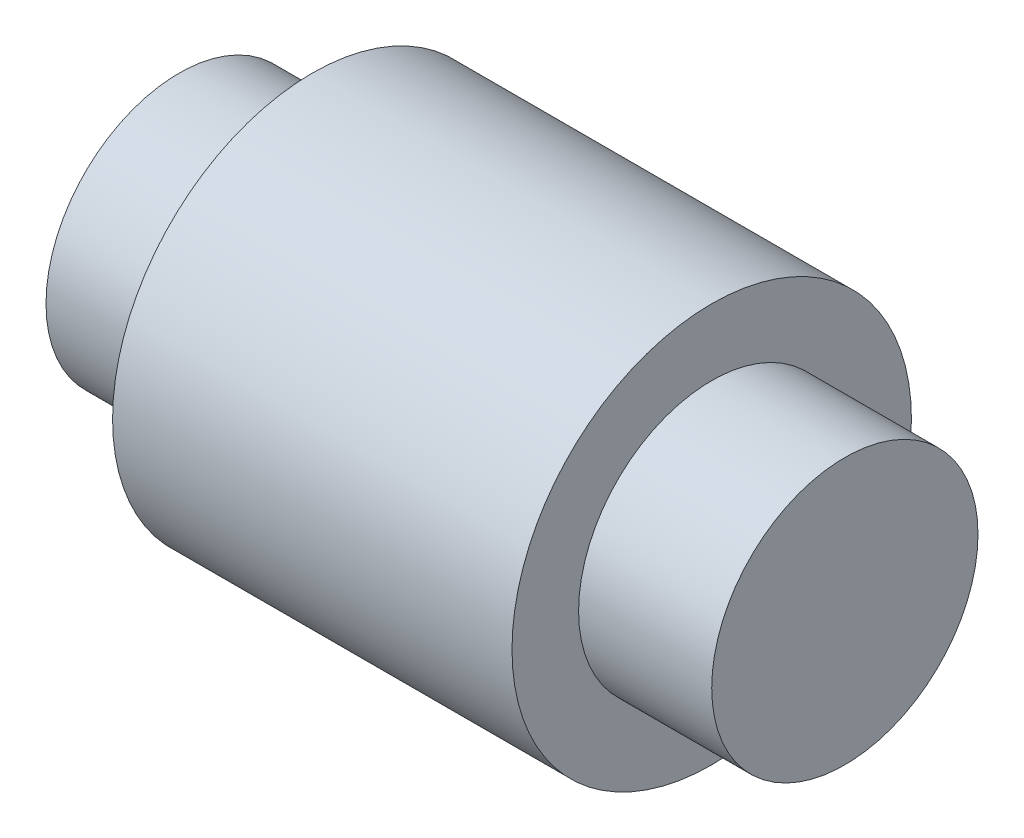
ISO-10303-21;
HEADER;
FILE_DESCRIPTION(('STEP AP214'),'2;1');
FILE_NAME('part.step','',(''),(''),'','','');
FILE_SCHEMA(('AUTOMOTIVE_DESIGN { 1 0 10303 214 1 1 1 1 }'));
ENDSEC;
DATA;
#1=APPLICATION_CONTEXT('core data for automotive mechanical design processes');
#2=APPLICATION_PROTOCOL_DEFINITION('international standard','automotive_design',2000,#1);
#3=PRODUCT_CONTEXT('',#1,'mechanical');
#4=PRODUCT('Part','Part','',(#3));
#5=PRODUCT_RELATED_PRODUCT_CATEGORY('part','',(#4));
#6=PRODUCT_DEFINITION_FORMATION('','',#4);
#7=PRODUCT_DEFINITION_CONTEXT('part definition',#1,'design');
#8=PRODUCT_DEFINITION('design','',#6,#7);
#9=PRODUCT_DEFINITION_SHAPE('','',#8);
#10=(LENGTH_UNIT() NAMED_UNIT(*) SI_UNIT(.MILLI.,.METRE.));
#11=(NAMED_UNIT(*) PLANE_ANGLE_UNIT() SI_UNIT($,.RADIAN.));
#12=(NAMED_UNIT(*) SI_UNIT($,.STERADIAN.) SOLID_ANGLE_UNIT());
#13=UNCERTAINTY_MEASURE_WITH_UNIT(LENGTH_MEASURE(1.E-05),#10,'distance_accuracy_value','');
#14=(GEOMETRIC_REPRESENTATION_CONTEXT(3) GLOBAL_UNCERTAINTY_ASSIGNED_CONTEXT((#13)) GLOBAL_UNIT_ASSIGNED_CONTEXT((#10,
#11,#12)) REPRESENTATION_CONTEXT('',''));
#15=CARTESIAN_POINT('',(0.,0.,0.));
#16=DIRECTION('',(0.,0.,1.));
#17=DIRECTION('',(1.,0.,0.));
#18=AXIS2_PLACEMENT_3D('',#15,#16,#17);
#19=CARTESIAN_POINT('',(0.,0.,0.));
#20=DIRECTION('',(1.,0.,0.));
#21=DIRECTION('',(0.,0.,-1.));
#22=AXIS2_PLACEMENT_3D('',#19,#20,#21);
#23=PLANE('',#22);
#24=CARTESIAN_POINT('',(0.,0.,0.));
#25=DIRECTION('',(-1.,0.,0.));
#26=DIRECTION('',(0.,0.,1.));
#27=AXIS2_PLACEMENT_3D('',#24,#25,#26);
#28=CIRCLE('',#27,20.);
#29=CARTESIAN_POINT('',(0.,0.,20.));
#30=VERTEX_POINT('',#29);
#31=EDGE_CURVE('E10',#30,#30,#28,.T.);
#32=ORIENTED_EDGE('',*,*,#31,.T.);
#33=EDGE_LOOP('',(#32));
#34=FACE_BOUND('',#33,.T.);
#35=ADVANCED_FACE('F37',(#34),#23,.F.);
#36=CARTESIAN_POINT('',(0.,0.,0.));
#37=DIRECTION('',(-1.,0.,0.));
#38=DIRECTION('',(0.,0.,1.));
#39=AXIS2_PLACEMENT_3D('',#36,#37,#38);
#40=CYLINDRICAL_SURFACE('',#39,20.);
#41=ORIENTED_EDGE('',*,*,#31,.F.);
#42=EDGE_LOOP('',(#41));
#43=FACE_BOUND('',#42,.T.);
#44=CARTESIAN_POINT('',(20.,0.,0.));
#45=DIRECTION('',(-1.,0.,0.));
#46=DIRECTION('',(0.,0.,1.));
#47=AXIS2_PLACEMENT_3D('',#44,#45,#46);
#48=CIRCLE('',#47,20.);
#49=CARTESIAN_POINT('',(20.,0.,20.));
#50=VERTEX_POINT('',#49);
#51=EDGE_CURVE('E43',#50,#50,#48,.T.);
#52=ORIENTED_EDGE('',*,*,#51,.T.);
#53=EDGE_LOOP('',(#52));
#54=FACE_BOUND('',#53,.T.);
#55=ADVANCED_FACE('F75',(#43,#54),#40,.T.);
#56=CARTESIAN_POINT('',(20.,20.,0.));
#57=DIRECTION('',(1.,0.,0.));
#58=DIRECTION('',(0.,0.,-1.));
#59=AXIS2_PLACEMENT_3D('',#56,#57,#58);
#60=PLANE('',#59);
#61=ORIENTED_EDGE('',*,*,#51,.F.);
#62=EDGE_LOOP('',(#61));
#63=FACE_BOUND('',#62,.T.);
#64=CARTESIAN_POINT('',(20.,0.,0.));
#65=DIRECTION('',(-1.,0.,0.));
#66=DIRECTION('',(0.,0.,1.));
#67=AXIS2_PLACEMENT_3D('',#64,#65,#66);
#68=CIRCLE('',#67,30.);
#69=CARTESIAN_POINT('',(20.,0.,30.));
#70=VERTEX_POINT('',#69);
#71=EDGE_CURVE('E47',#70,#70,#68,.T.);
#72=ORIENTED_EDGE('',*,*,#71,.T.);
#73=EDGE_LOOP('',(#72));
#74=FACE_BOUND('',#73,.T.);
#75=ADVANCED_FACE('F79',(#63,#74),#60,.F.);
#76=CARTESIAN_POINT('',(0.,0.,0.));
#77=DIRECTION('',(-1.,0.,0.));
#78=DIRECTION('',(0.,0.,1.));
#79=AXIS2_PLACEMENT_3D('',#76,#77,#78);
#80=CYLINDRICAL_SURFACE('',#79,30.);
#81=ORIENTED_EDGE('',*,*,#71,.F.);
#82=EDGE_LOOP('',(#81));
#83=FACE_BOUND('',#82,.T.);
#84=CARTESIAN_POINT('',(80.,0.,0.));
#85=DIRECTION('',(-1.,0.,0.));
#86=DIRECTION('',(0.,0.,1.));
#87=AXIS2_PLACEMENT_3D('',#84,#85,#86);
#88=CIRCLE('',#87,30.);
#89=CARTESIAN_POINT('',(80.,0.,30.));
#90=VERTEX_POINT('',#89);
#91=EDGE_CURVE('E51',#90,#90,#88,.T.);
#92=ORIENTED_EDGE('',*,*,#91,.T.);
#93=EDGE_LOOP('',(#92));
#94=FACE_BOUND('',#93,.T.);
#95=ADVANCED_FACE('F84',(#83,#94),#80,.T.);
#96=CARTESIAN_POINT('',(80.,30.,0.));
#97=DIRECTION('',(-1.,0.,0.));
#98=DIRECTION('',(0.,0.,1.));
#99=AXIS2_PLACEMENT_3D('',#96,#97,#98);
#100=PLANE('',#99);
#101=ORIENTED_EDGE('',*,*,#91,.F.);
#102=EDGE_LOOP('',(#101));
#103=FACE_BOUND('',#102,.T.);
#104=CARTESIAN_POINT('',(80.,0.,0.));
#105=DIRECTION('',(-1.,0.,0.));
#106=DIRECTION('',(0.,0.,1.));
#107=AXIS2_PLACEMENT_3D('',#104,#105,#106);
#108=CIRCLE('',#107,20.);
#109=CARTESIAN_POINT('',(80.,0.,20.));
#110=VERTEX_POINT('',#109);
#111=EDGE_CURVE('E56',#110,#110,#108,.T.);
#112=ORIENTED_EDGE('',*,*,#111,.T.);
#113=EDGE_LOOP('',(#112));
#114=FACE_BOUND('',#113,.T.);
#115=ADVANCED_FACE('F71',(#103,#114),#100,.F.);
#116=CARTESIAN_POINT('',(0.,0.,0.));
#117=DIRECTION('',(-1.,0.,0.));
#118=DIRECTION('',(0.,0.,1.));
#119=AXIS2_PLACEMENT_3D('',#116,#117,#118);
#120=CYLINDRICAL_SURFACE('',#119,20.);
#121=ORIENTED_EDGE('',*,*,#111,.F.);
#122=EDGE_LOOP('',(#121));
#123=FACE_BOUND('',#122,.T.);
#124=CARTESIAN_POINT('',(100.,0.,0.));
#125=DIRECTION('',(-1.,0.,0.));
#126=DIRECTION('',(0.,0.,1.));
#127=AXIS2_PLACEMENT_3D('',#124,#125,#126);
#128=CIRCLE('',#127,20.);
#129=CARTESIAN_POINT('',(100.,0.,20.));
#130=VERTEX_POINT('',#129);
#131=EDGE_CURVE('E59',#130,#130,#128,.T.);
#132=ORIENTED_EDGE('',*,*,#131,.T.);
#133=EDGE_LOOP('',(#132));
#134=FACE_BOUND('',#133,.T.);
#135=ADVANCED_FACE('F63',(#123,#134),#120,.T.);
#136=CARTESIAN_POINT('',(100.,20.,0.));
#137=DIRECTION('',(-1.,0.,0.));
#138=DIRECTION('',(0.,0.,1.));
#139=AXIS2_PLACEMENT_3D('',#136,#137,#138);
#140=PLANE('',#139);
#141=ORIENTED_EDGE('',*,*,#131,.F.);
#142=EDGE_LOOP('',(#141));
#143=FACE_BOUND('',#142,.T.);
#144=ADVANCED_FACE('F65',(#143),#140,.F.);
#145=CLOSED_SHELL('',(#35,#55,#75,#95,#115,#135,#144));
#146=MANIFOLD_SOLID_BREP('B2',#145);
#147=ADVANCED_BREP_SHAPE_REPRESENTATION('',(#18,#146),#14);
#148=SHAPE_DEFINITION_REPRESENTATION(#9,#147);
ENDSEC;
END-ISO-10303-21;
